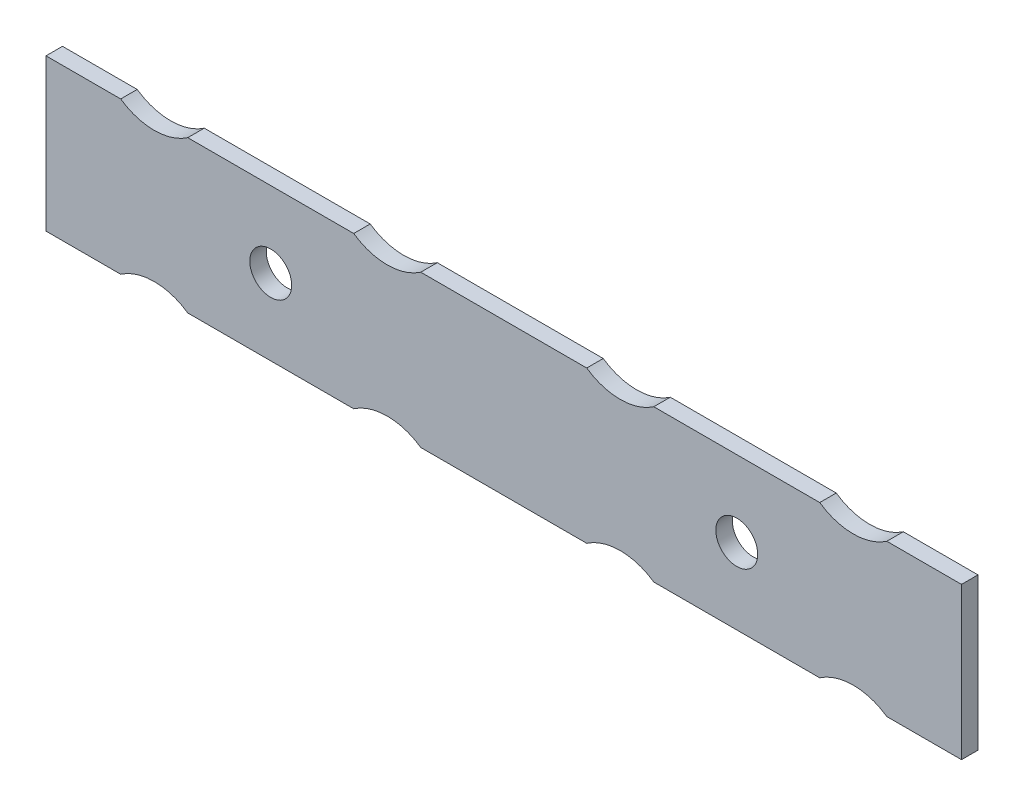
ISO-10303-21;
HEADER;
FILE_DESCRIPTION(('STEP AP214'),'2;1');
FILE_NAME('part.step','',(''),(''),'','','');
FILE_SCHEMA(('AUTOMOTIVE_DESIGN { 1 0 10303 214 1 1 1 1 }'));
ENDSEC;
DATA;
#1=APPLICATION_CONTEXT('core data for automotive mechanical design processes');
#2=APPLICATION_PROTOCOL_DEFINITION('international standard','automotive_design',2000,#1);
#3=PRODUCT_CONTEXT('',#1,'mechanical');
#4=PRODUCT('Part','Part','',(#3));
#5=PRODUCT_RELATED_PRODUCT_CATEGORY('part','',(#4));
#6=PRODUCT_DEFINITION_FORMATION('','',#4);
#7=PRODUCT_DEFINITION_CONTEXT('part definition',#1,'design');
#8=PRODUCT_DEFINITION('design','',#6,#7);
#9=PRODUCT_DEFINITION_SHAPE('','',#8);
#10=(LENGTH_UNIT() NAMED_UNIT(*) SI_UNIT(.MILLI.,.METRE.));
#11=(NAMED_UNIT(*) PLANE_ANGLE_UNIT() SI_UNIT($,.RADIAN.));
#12=(NAMED_UNIT(*) SI_UNIT($,.STERADIAN.) SOLID_ANGLE_UNIT());
#13=UNCERTAINTY_MEASURE_WITH_UNIT(LENGTH_MEASURE(1.E-05),#10,'distance_accuracy_value','');
#14=(GEOMETRIC_REPRESENTATION_CONTEXT(3) GLOBAL_UNCERTAINTY_ASSIGNED_CONTEXT((#13)) GLOBAL_UNIT_ASSIGNED_CONTEXT((#10,
#11,#12)) REPRESENTATION_CONTEXT('',''));
#15=CARTESIAN_POINT('',(0.,0.,0.));
#16=DIRECTION('',(0.,0.,1.));
#17=DIRECTION('',(1.,0.,0.));
#18=AXIS2_PLACEMENT_3D('',#15,#16,#17);
#19=CARTESIAN_POINT('',(22.606,0.,1.6));
#20=DIRECTION('',(0.,0.,1.));
#21=DIRECTION('',(1.,0.,0.));
#22=AXIS2_PLACEMENT_3D('',#19,#20,#21);
#23=PLANE('',#22);
#24=CARTESIAN_POINT('',(11.3029999999999,12.065,1.6));
#25=DIRECTION('',(0.,0.,1.));
#26=DIRECTION('',(1.,0.,0.));
#27=AXIS2_PLACEMENT_3D('',#24,#25,#26);
#28=CIRCLE('',#27,2.032);
#29=CARTESIAN_POINT('',(13.3349999999999,12.065,1.6));
#30=VERTEX_POINT('',#29);
#31=EDGE_CURVE('E209',#30,#30,#28,.T.);
#32=ORIENTED_EDGE('',*,*,#31,.F.);
#33=EDGE_LOOP('',(#32));
#34=FACE_BOUND('',#33,.T.);
#35=CARTESIAN_POINT('',(22.606,0.,1.6));
#36=DIRECTION('',(0.,0.,-1.));
#37=DIRECTION('',(1.,0.,0.));
#38=AXIS2_PLACEMENT_3D('',#35,#36,#37);
#39=CIRCLE('',#38,5.715999998);
#40=CARTESIAN_POINT('',(19.3529005554801,4.699999998,1.6));
#41=VERTEX_POINT('',#40);
#42=CARTESIAN_POINT('',(25.85909944452,4.699999998,1.6));
#43=VERTEX_POINT('',#42);
#44=EDGE_CURVE('E244',#41,#43,#39,.T.);
#45=ORIENTED_EDGE('',*,*,#44,.T.);
#46=DIRECTION('',(1.,0.,0.));
#47=VECTOR('',#46,1.);
#48=CARTESIAN_POINT('',(25.85909944452,4.699999998,1.6));
#49=LINE('',#48,#47);
#50=CARTESIAN_POINT('',(41.95890055548,4.699999998,1.6));
#51=VERTEX_POINT('',#50);
#52=EDGE_CURVE('E132',#43,#51,#49,.T.);
#53=ORIENTED_EDGE('',*,*,#52,.T.);
#54=CARTESIAN_POINT('',(45.212,0.,1.6));
#55=DIRECTION('',(0.,0.,-1.));
#56=DIRECTION('',(1.,0.,0.));
#57=AXIS2_PLACEMENT_3D('',#54,#55,#56);
#58=CIRCLE('',#57,5.715999998);
#59=CARTESIAN_POINT('',(48.46509944452,4.699999998,1.6));
#60=VERTEX_POINT('',#59);
#61=EDGE_CURVE('E295',#51,#60,#58,.T.);
#62=ORIENTED_EDGE('',*,*,#61,.T.);
#63=DIRECTION('',(1.,0.,0.));
#64=VECTOR('',#63,1.);
#65=CARTESIAN_POINT('',(48.46509944452,4.699999998,1.6));
#66=LINE('',#65,#64);
#67=CARTESIAN_POINT('',(64.5649005554801,4.699999998,1.6));
#68=VERTEX_POINT('',#67);
#69=EDGE_CURVE('E314',#60,#68,#66,.T.);
#70=ORIENTED_EDGE('',*,*,#69,.T.);
#71=CARTESIAN_POINT('',(67.818,0.,1.6));
#72=DIRECTION('',(0.,0.,-1.));
#73=DIRECTION('',(1.,0.,0.));
#74=AXIS2_PLACEMENT_3D('',#71,#72,#73);
#75=CIRCLE('',#74,5.715999998);
#76=CARTESIAN_POINT('',(71.07109944452,4.699999998,1.6));
#77=VERTEX_POINT('',#76);
#78=EDGE_CURVE('E311',#68,#77,#75,.T.);
#79=ORIENTED_EDGE('',*,*,#78,.T.);
#80=DIRECTION('',(1.,0.,0.));
#81=VECTOR('',#80,1.);
#82=CARTESIAN_POINT('',(71.07109944452,4.699999998,1.6));
#83=LINE('',#82,#81);
#84=CARTESIAN_POINT('',(78.3179999999999,4.699999998,1.6));
#85=VERTEX_POINT('',#84);
#86=EDGE_CURVE('E313',#77,#85,#83,.T.);
#87=ORIENTED_EDGE('',*,*,#86,.T.);
#88=DIRECTION('',(0.,1.,0.));
#89=VECTOR('',#88,1.);
#90=CARTESIAN_POINT('',(78.3179999999999,4.699999998,1.6));
#91=LINE('',#90,#89);
#92=CARTESIAN_POINT('',(78.3179999999999,19.430000002,1.6));
#93=VERTEX_POINT('',#92);
#94=EDGE_CURVE('E316',#85,#93,#91,.T.);
#95=ORIENTED_EDGE('',*,*,#94,.T.);
#96=DIRECTION('',(-1.,0.,0.));
#97=VECTOR('',#96,1.);
#98=CARTESIAN_POINT('',(71.0710994445199,19.430000002,1.6));
#99=LINE('',#98,#97);
#100=CARTESIAN_POINT('',(71.0710994445199,19.430000002,1.6));
#101=VERTEX_POINT('',#100);
#102=EDGE_CURVE('E322',#93,#101,#99,.T.);
#103=ORIENTED_EDGE('',*,*,#102,.T.);
#104=CARTESIAN_POINT('',(67.8179999999999,24.13,1.6));
#105=DIRECTION('',(0.,0.,-1.));
#106=DIRECTION('',(1.,0.,0.));
#107=AXIS2_PLACEMENT_3D('',#104,#105,#106);
#108=CIRCLE('',#107,5.715999998);
#109=CARTESIAN_POINT('',(64.56490055548,19.430000002,1.6));
#110=VERTEX_POINT('',#109);
#111=EDGE_CURVE('E324',#101,#110,#108,.T.);
#112=ORIENTED_EDGE('',*,*,#111,.T.);
#113=DIRECTION('',(-1.,0.,0.));
#114=VECTOR('',#113,1.);
#115=CARTESIAN_POINT('',(48.4650994445199,19.430000002,1.6));
#116=LINE('',#115,#114);
#117=CARTESIAN_POINT('',(48.4650994445199,19.430000002,1.6));
#118=VERTEX_POINT('',#117);
#119=EDGE_CURVE('E326',#110,#118,#116,.T.);
#120=ORIENTED_EDGE('',*,*,#119,.T.);
#121=CARTESIAN_POINT('',(45.2119999999999,24.13,1.6));
#122=DIRECTION('',(0.,0.,-1.));
#123=DIRECTION('',(1.,0.,0.));
#124=AXIS2_PLACEMENT_3D('',#121,#122,#123);
#125=CIRCLE('',#124,5.715999998);
#126=CARTESIAN_POINT('',(41.95890055548,19.430000002,1.6));
#127=VERTEX_POINT('',#126);
#128=EDGE_CURVE('E328',#118,#127,#125,.T.);
#129=ORIENTED_EDGE('',*,*,#128,.T.);
#130=DIRECTION('',(-1.,0.,0.));
#131=VECTOR('',#130,1.);
#132=CARTESIAN_POINT('',(25.8590994445199,19.430000002,1.6));
#133=LINE('',#132,#131);
#134=CARTESIAN_POINT('',(25.8590994445199,19.430000002,1.6));
#135=VERTEX_POINT('',#134);
#136=EDGE_CURVE('E330',#127,#135,#133,.T.);
#137=ORIENTED_EDGE('',*,*,#136,.T.);
#138=CARTESIAN_POINT('',(22.6059999999999,24.13,1.6));
#139=DIRECTION('',(0.,0.,-1.));
#140=DIRECTION('',(1.,0.,0.));
#141=AXIS2_PLACEMENT_3D('',#138,#139,#140);
#142=CIRCLE('',#141,5.715999998);
#143=CARTESIAN_POINT('',(19.35290055548,19.430000002,1.6));
#144=VERTEX_POINT('',#143);
#145=EDGE_CURVE('E332',#135,#144,#142,.T.);
#146=ORIENTED_EDGE('',*,*,#145,.T.);
#147=DIRECTION('',(-1.,0.,0.));
#148=VECTOR('',#147,1.);
#149=CARTESIAN_POINT('',(3.25309944451987,19.430000002,1.6));
#150=LINE('',#149,#148);
#151=CARTESIAN_POINT('',(3.25309944451987,19.430000002,1.6));
#152=VERTEX_POINT('',#151);
#153=EDGE_CURVE('E334',#144,#152,#150,.T.);
#154=ORIENTED_EDGE('',*,*,#153,.T.);
#155=CARTESIAN_POINT('',(0.,24.13,1.6));
#156=DIRECTION('',(0.,0.,-1.));
#157=DIRECTION('',(1.,0.,0.));
#158=AXIS2_PLACEMENT_3D('',#155,#156,#157);
#159=CIRCLE('',#158,5.715999998);
#160=CARTESIAN_POINT('',(-3.25309944452003,19.430000002,1.6));
#161=VERTEX_POINT('',#160);
#162=EDGE_CURVE('E336',#152,#161,#159,.T.);
#163=ORIENTED_EDGE('',*,*,#162,.T.);
#164=DIRECTION('',(-1.,0.,0.));
#165=VECTOR('',#164,1.);
#166=CARTESIAN_POINT('',(-10.5,19.430000002,1.6));
#167=LINE('',#166,#165);
#168=CARTESIAN_POINT('',(-10.5,19.430000002,1.6));
#169=VERTEX_POINT('',#168);
#170=EDGE_CURVE('E338',#161,#169,#167,.T.);
#171=ORIENTED_EDGE('',*,*,#170,.T.);
#172=DIRECTION('',(0.,-1.,0.));
#173=VECTOR('',#172,1.);
#174=CARTESIAN_POINT('',(-10.5,4.699999998,1.6));
#175=LINE('',#174,#173);
#176=CARTESIAN_POINT('',(-10.5,4.699999998,1.6));
#177=VERTEX_POINT('',#176);
#178=EDGE_CURVE('E187',#169,#177,#175,.T.);
#179=ORIENTED_EDGE('',*,*,#178,.T.);
#180=DIRECTION('',(1.,0.,0.));
#181=VECTOR('',#180,1.);
#182=CARTESIAN_POINT('',(-10.5,4.699999998,1.6));
#183=LINE('',#182,#181);
#184=CARTESIAN_POINT('',(-3.25309944451995,4.699999998,1.6));
#185=VERTEX_POINT('',#184);
#186=EDGE_CURVE('E181',#177,#185,#183,.T.);
#187=ORIENTED_EDGE('',*,*,#186,.T.);
#188=CARTESIAN_POINT('',(0.,0.,1.6));
#189=DIRECTION('',(0.,0.,-1.));
#190=DIRECTION('',(1.,0.,0.));
#191=AXIS2_PLACEMENT_3D('',#188,#189,#190);
#192=CIRCLE('',#191,5.715999998);
#193=CARTESIAN_POINT('',(3.25309944451995,4.699999998,1.6));
#194=VERTEX_POINT('',#193);
#195=EDGE_CURVE('E185',#185,#194,#192,.T.);
#196=ORIENTED_EDGE('',*,*,#195,.T.);
#197=DIRECTION('',(1.,0.,0.));
#198=VECTOR('',#197,1.);
#199=CARTESIAN_POINT('',(3.25309944451995,4.699999998,1.6));
#200=LINE('',#199,#198);
#201=EDGE_CURVE('E53',#194,#41,#200,.T.);
#202=ORIENTED_EDGE('',*,*,#201,.T.);
#203=EDGE_LOOP('',(#45,#53,#62,#70,#79,#87,#95,#103,#112,#120,#129,#137,#146,#154,#163,#171,
#179,#187,#196,#202));
#204=FACE_BOUND('',#203,.T.);
#205=CARTESIAN_POINT('',(56.5149999999999,12.065,1.6));
#206=DIRECTION('',(0.,0.,1.));
#207=DIRECTION('',(1.,0.,0.));
#208=AXIS2_PLACEMENT_3D('',#205,#206,#207);
#209=CIRCLE('',#208,2.032);
#210=CARTESIAN_POINT('',(58.5469999999999,12.065,1.6));
#211=VERTEX_POINT('',#210);
#212=EDGE_CURVE('E380',#211,#211,#209,.T.);
#213=ORIENTED_EDGE('',*,*,#212,.F.);
#214=EDGE_LOOP('',(#213));
#215=FACE_BOUND('',#214,.T.);
#216=ADVANCED_FACE('F36',(#34,#204,#215),#23,.T.);
#217=CARTESIAN_POINT('',(22.606,0.,0.));
#218=DIRECTION('',(0.,0.,1.));
#219=DIRECTION('',(1.,0.,0.));
#220=AXIS2_PLACEMENT_3D('',#217,#218,#219);
#221=PLANE('',#220);
#222=CARTESIAN_POINT('',(22.606,0.,0.));
#223=DIRECTION('',(0.,0.,-1.));
#224=DIRECTION('',(1.,0.,0.));
#225=AXIS2_PLACEMENT_3D('',#222,#223,#224);
#226=CIRCLE('',#225,5.715999998);
#227=CARTESIAN_POINT('',(19.3529005554801,4.699999998,0.));
#228=VERTEX_POINT('',#227);
#229=CARTESIAN_POINT('',(25.85909944452,4.699999998,0.));
#230=VERTEX_POINT('',#229);
#231=EDGE_CURVE('E205',#228,#230,#226,.T.);
#232=ORIENTED_EDGE('',*,*,#231,.F.);
#233=DIRECTION('',(1.,0.,0.));
#234=VECTOR('',#233,1.);
#235=CARTESIAN_POINT('',(3.25309944451995,4.699999998,0.));
#236=LINE('',#235,#234);
#237=CARTESIAN_POINT('',(3.25309944451995,4.699999998,0.));
#238=VERTEX_POINT('',#237);
#239=EDGE_CURVE('E124',#238,#228,#236,.T.);
#240=ORIENTED_EDGE('',*,*,#239,.F.);
#241=CARTESIAN_POINT('',(0.,0.,0.));
#242=DIRECTION('',(0.,0.,-1.));
#243=DIRECTION('',(1.,0.,0.));
#244=AXIS2_PLACEMENT_3D('',#241,#242,#243);
#245=CIRCLE('',#244,5.715999998);
#246=CARTESIAN_POINT('',(-3.25309944451995,4.699999998,0.));
#247=VERTEX_POINT('',#246);
#248=EDGE_CURVE('E118',#247,#238,#245,.T.);
#249=ORIENTED_EDGE('',*,*,#248,.F.);
#250=DIRECTION('',(1.,0.,0.));
#251=VECTOR('',#250,1.);
#252=CARTESIAN_POINT('',(-10.5,4.699999998,0.));
#253=LINE('',#252,#251);
#254=CARTESIAN_POINT('',(-10.5,4.699999998,0.));
#255=VERTEX_POINT('',#254);
#256=EDGE_CURVE('E195',#255,#247,#253,.T.);
#257=ORIENTED_EDGE('',*,*,#256,.F.);
#258=DIRECTION('',(0.,-1.,0.));
#259=VECTOR('',#258,1.);
#260=CARTESIAN_POINT('',(-10.5,4.699999998,0.));
#261=LINE('',#260,#259);
#262=CARTESIAN_POINT('',(-10.5,19.430000002,0.));
#263=VERTEX_POINT('',#262);
#264=EDGE_CURVE('E239',#263,#255,#261,.T.);
#265=ORIENTED_EDGE('',*,*,#264,.F.);
#266=DIRECTION('',(-1.,0.,0.));
#267=VECTOR('',#266,1.);
#268=CARTESIAN_POINT('',(-10.5,19.430000002,0.));
#269=LINE('',#268,#267);
#270=CARTESIAN_POINT('',(-3.25309944452003,19.430000002,0.));
#271=VERTEX_POINT('',#270);
#272=EDGE_CURVE('E237',#271,#263,#269,.T.);
#273=ORIENTED_EDGE('',*,*,#272,.F.);
#274=CARTESIAN_POINT('',(0.,24.13,0.));
#275=DIRECTION('',(0.,0.,-1.));
#276=DIRECTION('',(1.,0.,0.));
#277=AXIS2_PLACEMENT_3D('',#274,#275,#276);
#278=CIRCLE('',#277,5.715999998);
#279=CARTESIAN_POINT('',(3.25309944451987,19.430000002,0.));
#280=VERTEX_POINT('',#279);
#281=EDGE_CURVE('E235',#280,#271,#278,.T.);
#282=ORIENTED_EDGE('',*,*,#281,.F.);
#283=DIRECTION('',(-1.,0.,0.));
#284=VECTOR('',#283,1.);
#285=CARTESIAN_POINT('',(3.25309944451987,19.430000002,0.));
#286=LINE('',#285,#284);
#287=CARTESIAN_POINT('',(19.35290055548,19.430000002,0.));
#288=VERTEX_POINT('',#287);
#289=EDGE_CURVE('E233',#288,#280,#286,.T.);
#290=ORIENTED_EDGE('',*,*,#289,.F.);
#291=CARTESIAN_POINT('',(22.6059999999999,24.13,0.));
#292=DIRECTION('',(0.,0.,-1.));
#293=DIRECTION('',(1.,0.,0.));
#294=AXIS2_PLACEMENT_3D('',#291,#292,#293);
#295=CIRCLE('',#294,5.715999998);
#296=CARTESIAN_POINT('',(25.8590994445199,19.430000002,0.));
#297=VERTEX_POINT('',#296);
#298=EDGE_CURVE('E231',#297,#288,#295,.T.);
#299=ORIENTED_EDGE('',*,*,#298,.F.);
#300=DIRECTION('',(-1.,0.,0.));
#301=VECTOR('',#300,1.);
#302=CARTESIAN_POINT('',(25.8590994445199,19.430000002,0.));
#303=LINE('',#302,#301);
#304=CARTESIAN_POINT('',(41.95890055548,19.430000002,0.));
#305=VERTEX_POINT('',#304);
#306=EDGE_CURVE('E229',#305,#297,#303,.T.);
#307=ORIENTED_EDGE('',*,*,#306,.F.);
#308=CARTESIAN_POINT('',(45.2119999999999,24.13,0.));
#309=DIRECTION('',(0.,0.,-1.));
#310=DIRECTION('',(1.,0.,0.));
#311=AXIS2_PLACEMENT_3D('',#308,#309,#310);
#312=CIRCLE('',#311,5.715999998);
#313=CARTESIAN_POINT('',(48.4650994445199,19.430000002,0.));
#314=VERTEX_POINT('',#313);
#315=EDGE_CURVE('E227',#314,#305,#312,.T.);
#316=ORIENTED_EDGE('',*,*,#315,.F.);
#317=DIRECTION('',(-1.,0.,0.));
#318=VECTOR('',#317,1.);
#319=CARTESIAN_POINT('',(48.4650994445199,19.430000002,0.));
#320=LINE('',#319,#318);
#321=CARTESIAN_POINT('',(64.56490055548,19.430000002,0.));
#322=VERTEX_POINT('',#321);
#323=EDGE_CURVE('E225',#322,#314,#320,.T.);
#324=ORIENTED_EDGE('',*,*,#323,.F.);
#325=CARTESIAN_POINT('',(67.8179999999999,24.13,0.));
#326=DIRECTION('',(0.,0.,-1.));
#327=DIRECTION('',(1.,0.,0.));
#328=AXIS2_PLACEMENT_3D('',#325,#326,#327);
#329=CIRCLE('',#328,5.715999998);
#330=CARTESIAN_POINT('',(71.0710994445199,19.430000002,0.));
#331=VERTEX_POINT('',#330);
#332=EDGE_CURVE('E223',#331,#322,#329,.T.);
#333=ORIENTED_EDGE('',*,*,#332,.F.);
#334=DIRECTION('',(-1.,0.,0.));
#335=VECTOR('',#334,1.);
#336=CARTESIAN_POINT('',(71.0710994445199,19.430000002,0.));
#337=LINE('',#336,#335);
#338=CARTESIAN_POINT('',(78.3179999999999,19.430000002,0.));
#339=VERTEX_POINT('',#338);
#340=EDGE_CURVE('E221',#339,#331,#337,.T.);
#341=ORIENTED_EDGE('',*,*,#340,.F.);
#342=DIRECTION('',(0.,1.,0.));
#343=VECTOR('',#342,1.);
#344=CARTESIAN_POINT('',(78.3179999999999,4.699999998,0.));
#345=LINE('',#344,#343);
#346=CARTESIAN_POINT('',(78.3179999999999,4.699999998,0.));
#347=VERTEX_POINT('',#346);
#348=EDGE_CURVE('E219',#347,#339,#345,.T.);
#349=ORIENTED_EDGE('',*,*,#348,.F.);
#350=DIRECTION('',(1.,0.,0.));
#351=VECTOR('',#350,1.);
#352=CARTESIAN_POINT('',(71.07109944452,4.699999998,0.));
#353=LINE('',#352,#351);
#354=CARTESIAN_POINT('',(71.07109944452,4.699999998,0.));
#355=VERTEX_POINT('',#354);
#356=EDGE_CURVE('E217',#355,#347,#353,.T.);
#357=ORIENTED_EDGE('',*,*,#356,.F.);
#358=CARTESIAN_POINT('',(67.818,0.,0.));
#359=DIRECTION('',(0.,0.,-1.));
#360=DIRECTION('',(1.,0.,0.));
#361=AXIS2_PLACEMENT_3D('',#358,#359,#360);
#362=CIRCLE('',#361,5.715999998);
#363=CARTESIAN_POINT('',(64.5649005554801,4.699999998,0.));
#364=VERTEX_POINT('',#363);
#365=EDGE_CURVE('E215',#364,#355,#362,.T.);
#366=ORIENTED_EDGE('',*,*,#365,.F.);
#367=DIRECTION('',(1.,0.,0.));
#368=VECTOR('',#367,1.);
#369=CARTESIAN_POINT('',(48.46509944452,4.699999998,0.));
#370=LINE('',#369,#368);
#371=CARTESIAN_POINT('',(48.46509944452,4.699999998,0.));
#372=VERTEX_POINT('',#371);
#373=EDGE_CURVE('E213',#372,#364,#370,.T.);
#374=ORIENTED_EDGE('',*,*,#373,.F.);
#375=CARTESIAN_POINT('',(45.212,0.,0.));
#376=DIRECTION('',(0.,0.,-1.));
#377=DIRECTION('',(1.,0.,0.));
#378=AXIS2_PLACEMENT_3D('',#375,#376,#377);
#379=CIRCLE('',#378,5.715999998);
#380=CARTESIAN_POINT('',(41.95890055548,4.699999998,0.));
#381=VERTEX_POINT('',#380);
#382=EDGE_CURVE('E211',#381,#372,#379,.T.);
#383=ORIENTED_EDGE('',*,*,#382,.F.);
#384=DIRECTION('',(1.,0.,0.));
#385=VECTOR('',#384,1.);
#386=CARTESIAN_POINT('',(25.85909944452,4.699999998,0.));
#387=LINE('',#386,#385);
#388=EDGE_CURVE('E208',#230,#381,#387,.T.);
#389=ORIENTED_EDGE('',*,*,#388,.F.);
#390=EDGE_LOOP('',(#232,#240,#249,#257,#265,#273,#282,#290,#299,#307,#316,#324,#333,#341,#349,
#357,#366,#374,#383,#389));
#391=FACE_BOUND('',#390,.T.);
#392=CARTESIAN_POINT('',(11.3029999999999,12.065,0.));
#393=DIRECTION('',(0.,0.,1.));
#394=DIRECTION('',(1.,0.,0.));
#395=AXIS2_PLACEMENT_3D('',#392,#393,#394);
#396=CIRCLE('',#395,2.032);
#397=CARTESIAN_POINT('',(13.3349999999999,12.065,0.));
#398=VERTEX_POINT('',#397);
#399=EDGE_CURVE('E386',#398,#398,#396,.T.);
#400=ORIENTED_EDGE('',*,*,#399,.T.);
#401=EDGE_LOOP('',(#400));
#402=FACE_BOUND('',#401,.T.);
#403=CARTESIAN_POINT('',(56.5149999999999,12.065,0.));
#404=DIRECTION('',(0.,0.,1.));
#405=DIRECTION('',(1.,0.,0.));
#406=AXIS2_PLACEMENT_3D('',#403,#404,#405);
#407=CIRCLE('',#406,2.032);
#408=CARTESIAN_POINT('',(58.5469999999999,12.065,0.));
#409=VERTEX_POINT('',#408);
#410=EDGE_CURVE('E383',#409,#409,#407,.T.);
#411=ORIENTED_EDGE('',*,*,#410,.T.);
#412=EDGE_LOOP('',(#411));
#413=FACE_BOUND('',#412,.T.);
#414=ADVANCED_FACE('F299',(#391,#402,#413),#221,.F.);
#415=CARTESIAN_POINT('',(22.606,0.,1.6));
#416=DIRECTION('',(0.,0.,-1.));
#417=DIRECTION('',(-1.,0.,0.));
#418=AXIS2_PLACEMENT_3D('',#415,#416,#417);
#419=CYLINDRICAL_SURFACE('',#418,5.715999998);
#420=ORIENTED_EDGE('',*,*,#231,.T.);
#421=DIRECTION('',(0.,0.,-1.));
#422=VECTOR('',#421,1.);
#423=CARTESIAN_POINT('',(25.85909944452,4.699999998,1.6));
#424=LINE('',#423,#422);
#425=EDGE_CURVE('E11',#43,#230,#424,.T.);
#426=ORIENTED_EDGE('',*,*,#425,.F.);
#427=ORIENTED_EDGE('',*,*,#44,.F.);
#428=DIRECTION('',(0.,0.,-1.));
#429=VECTOR('',#428,1.);
#430=CARTESIAN_POINT('',(19.3529005554801,4.699999998,1.6));
#431=LINE('',#430,#429);
#432=EDGE_CURVE('E201',#41,#228,#431,.T.);
#433=ORIENTED_EDGE('',*,*,#432,.T.);
#434=EDGE_LOOP('',(#420,#426,#427,#433));
#435=FACE_BOUND('',#434,.T.);
#436=ADVANCED_FACE('F38',(#435),#419,.F.);
#437=CARTESIAN_POINT('',(25.85909944452,4.699999998,1.6));
#438=DIRECTION('',(0.,1.,0.));
#439=DIRECTION('',(0.,0.,1.));
#440=AXIS2_PLACEMENT_3D('',#437,#438,#439);
#441=PLANE('',#440);
#442=ORIENTED_EDGE('',*,*,#388,.T.);
#443=DIRECTION('',(0.,0.,-1.));
#444=VECTOR('',#443,1.);
#445=CARTESIAN_POINT('',(41.95890055548,4.699999998,1.6));
#446=LINE('',#445,#444);
#447=EDGE_CURVE('E45',#51,#381,#446,.T.);
#448=ORIENTED_EDGE('',*,*,#447,.F.);
#449=ORIENTED_EDGE('',*,*,#52,.F.);
#450=ORIENTED_EDGE('',*,*,#425,.T.);
#451=EDGE_LOOP('',(#442,#448,#449,#450));
#452=FACE_BOUND('',#451,.T.);
#453=ADVANCED_FACE('F559',(#452),#441,.F.);
#454=CARTESIAN_POINT('',(45.212,0.,1.6));
#455=DIRECTION('',(0.,0.,-1.));
#456=DIRECTION('',(-1.,0.,0.));
#457=AXIS2_PLACEMENT_3D('',#454,#455,#456);
#458=CYLINDRICAL_SURFACE('',#457,5.715999998);
#459=ORIENTED_EDGE('',*,*,#382,.T.);
#460=DIRECTION('',(0.,0.,-1.));
#461=VECTOR('',#460,1.);
#462=CARTESIAN_POINT('',(48.46509944452,4.699999998,1.6));
#463=LINE('',#462,#461);
#464=EDGE_CURVE('E287',#60,#372,#463,.T.);
#465=ORIENTED_EDGE('',*,*,#464,.F.);
#466=ORIENTED_EDGE('',*,*,#61,.F.);
#467=ORIENTED_EDGE('',*,*,#447,.T.);
#468=EDGE_LOOP('',(#459,#465,#466,#467));
#469=FACE_BOUND('',#468,.T.);
#470=ADVANCED_FACE('F293',(#469),#458,.F.);
#471=CARTESIAN_POINT('',(48.46509944452,4.699999998,1.6));
#472=DIRECTION('',(0.,1.,0.));
#473=DIRECTION('',(-1.,0.,0.));
#474=AXIS2_PLACEMENT_3D('',#471,#472,#473);
#475=PLANE('',#474);
#476=ORIENTED_EDGE('',*,*,#373,.T.);
#477=DIRECTION('',(0.,0.,-1.));
#478=VECTOR('',#477,1.);
#479=CARTESIAN_POINT('',(64.5649005554801,4.699999998,1.6));
#480=LINE('',#479,#478);
#481=EDGE_CURVE('E284',#68,#364,#480,.T.);
#482=ORIENTED_EDGE('',*,*,#481,.F.);
#483=ORIENTED_EDGE('',*,*,#69,.F.);
#484=ORIENTED_EDGE('',*,*,#464,.T.);
#485=EDGE_LOOP('',(#476,#482,#483,#484));
#486=FACE_BOUND('',#485,.T.);
#487=ADVANCED_FACE('F305',(#486),#475,.F.);
#488=CARTESIAN_POINT('',(67.818,0.,1.6));
#489=DIRECTION('',(0.,0.,-1.));
#490=DIRECTION('',(-1.,0.,0.));
#491=AXIS2_PLACEMENT_3D('',#488,#489,#490);
#492=CYLINDRICAL_SURFACE('',#491,5.715999998);
#493=ORIENTED_EDGE('',*,*,#365,.T.);
#494=DIRECTION('',(0.,0.,-1.));
#495=VECTOR('',#494,1.);
#496=CARTESIAN_POINT('',(71.07109944452,4.699999998,1.6));
#497=LINE('',#496,#495);
#498=EDGE_CURVE('E281',#77,#355,#497,.T.);
#499=ORIENTED_EDGE('',*,*,#498,.F.);
#500=ORIENTED_EDGE('',*,*,#78,.F.);
#501=ORIENTED_EDGE('',*,*,#481,.T.);
#502=EDGE_LOOP('',(#493,#499,#500,#501));
#503=FACE_BOUND('',#502,.T.);
#504=ADVANCED_FACE('F309',(#503),#492,.F.);
#505=CARTESIAN_POINT('',(71.07109944452,4.699999998,1.6));
#506=DIRECTION('',(0.,1.,0.));
#507=DIRECTION('',(-1.,0.,0.));
#508=AXIS2_PLACEMENT_3D('',#505,#506,#507);
#509=PLANE('',#508);
#510=ORIENTED_EDGE('',*,*,#356,.T.);
#511=DIRECTION('',(0.,0.,-1.));
#512=VECTOR('',#511,1.);
#513=CARTESIAN_POINT('',(78.3179999999999,4.699999998,1.6));
#514=LINE('',#513,#512);
#515=EDGE_CURVE('E278',#85,#347,#514,.T.);
#516=ORIENTED_EDGE('',*,*,#515,.F.);
#517=ORIENTED_EDGE('',*,*,#86,.F.);
#518=ORIENTED_EDGE('',*,*,#498,.T.);
#519=EDGE_LOOP('',(#510,#516,#517,#518));
#520=FACE_BOUND('',#519,.T.);
#521=ADVANCED_FACE('F524',(#520),#509,.F.);
#522=CARTESIAN_POINT('',(78.3179999999999,4.699999998,1.6));
#523=DIRECTION('',(-1.,0.,0.));
#524=DIRECTION('',(0.,0.,1.));
#525=AXIS2_PLACEMENT_3D('',#522,#523,#524);
#526=PLANE('',#525);
#527=ORIENTED_EDGE('',*,*,#348,.T.);
#528=DIRECTION('',(0.,0.,-1.));
#529=VECTOR('',#528,1.);
#530=CARTESIAN_POINT('',(78.3179999999999,19.430000002,1.6));
#531=LINE('',#530,#529);
#532=EDGE_CURVE('E275',#93,#339,#531,.T.);
#533=ORIENTED_EDGE('',*,*,#532,.F.);
#534=ORIENTED_EDGE('',*,*,#94,.F.);
#535=ORIENTED_EDGE('',*,*,#515,.T.);
#536=EDGE_LOOP('',(#527,#533,#534,#535));
#537=FACE_BOUND('',#536,.T.);
#538=ADVANCED_FACE('F514',(#537),#526,.F.);
#539=CARTESIAN_POINT('',(71.0710994445199,19.430000002,1.6));
#540=DIRECTION('',(0.,-1.,0.));
#541=DIRECTION('',(0.,0.,-1.));
#542=AXIS2_PLACEMENT_3D('',#539,#540,#541);
#543=PLANE('',#542);
#544=ORIENTED_EDGE('',*,*,#340,.T.);
#545=DIRECTION('',(0.,0.,-1.));
#546=VECTOR('',#545,1.);
#547=CARTESIAN_POINT('',(71.0710994445199,19.430000002,1.6));
#548=LINE('',#547,#546);
#549=EDGE_CURVE('E272',#101,#331,#548,.T.);
#550=ORIENTED_EDGE('',*,*,#549,.F.);
#551=ORIENTED_EDGE('',*,*,#102,.F.);
#552=ORIENTED_EDGE('',*,*,#532,.T.);
#553=EDGE_LOOP('',(#544,#550,#551,#552));
#554=FACE_BOUND('',#553,.T.);
#555=ADVANCED_FACE('F504',(#554),#543,.F.);
#556=CARTESIAN_POINT('',(67.8179999999999,24.13,1.6));
#557=DIRECTION('',(0.,0.,-1.));
#558=DIRECTION('',(-1.,0.,0.));
#559=AXIS2_PLACEMENT_3D('',#556,#557,#558);
#560=CYLINDRICAL_SURFACE('',#559,5.715999998);
#561=ORIENTED_EDGE('',*,*,#332,.T.);
#562=DIRECTION('',(0.,0.,-1.));
#563=VECTOR('',#562,1.);
#564=CARTESIAN_POINT('',(64.56490055548,19.430000002,1.6));
#565=LINE('',#564,#563);
#566=EDGE_CURVE('E269',#110,#322,#565,.T.);
#567=ORIENTED_EDGE('',*,*,#566,.F.);
#568=ORIENTED_EDGE('',*,*,#111,.F.);
#569=ORIENTED_EDGE('',*,*,#549,.T.);
#570=EDGE_LOOP('',(#561,#567,#568,#569));
#571=FACE_BOUND('',#570,.T.);
#572=ADVANCED_FACE('F494',(#571),#560,.F.);
#573=CARTESIAN_POINT('',(48.4650994445199,19.430000002,1.6));
#574=DIRECTION('',(0.,-1.,0.));
#575=DIRECTION('',(0.,0.,-1.));
#576=AXIS2_PLACEMENT_3D('',#573,#574,#575);
#577=PLANE('',#576);
#578=ORIENTED_EDGE('',*,*,#323,.T.);
#579=DIRECTION('',(0.,0.,-1.));
#580=VECTOR('',#579,1.);
#581=CARTESIAN_POINT('',(48.4650994445199,19.430000002,1.6));
#582=LINE('',#581,#580);
#583=EDGE_CURVE('E266',#118,#314,#582,.T.);
#584=ORIENTED_EDGE('',*,*,#583,.F.);
#585=ORIENTED_EDGE('',*,*,#119,.F.);
#586=ORIENTED_EDGE('',*,*,#566,.T.);
#587=EDGE_LOOP('',(#578,#584,#585,#586));
#588=FACE_BOUND('',#587,.T.);
#589=ADVANCED_FACE('F484',(#588),#577,.F.);
#590=CARTESIAN_POINT('',(45.2119999999999,24.13,1.6));
#591=DIRECTION('',(0.,0.,-1.));
#592=DIRECTION('',(-1.,0.,0.));
#593=AXIS2_PLACEMENT_3D('',#590,#591,#592);
#594=CYLINDRICAL_SURFACE('',#593,5.715999998);
#595=ORIENTED_EDGE('',*,*,#315,.T.);
#596=DIRECTION('',(0.,0.,-1.));
#597=VECTOR('',#596,1.);
#598=CARTESIAN_POINT('',(41.95890055548,19.430000002,1.6));
#599=LINE('',#598,#597);
#600=EDGE_CURVE('E263',#127,#305,#599,.T.);
#601=ORIENTED_EDGE('',*,*,#600,.F.);
#602=ORIENTED_EDGE('',*,*,#128,.F.);
#603=ORIENTED_EDGE('',*,*,#583,.T.);
#604=EDGE_LOOP('',(#595,#601,#602,#603));
#605=FACE_BOUND('',#604,.T.);
#606=ADVANCED_FACE('F474',(#605),#594,.F.);
#607=CARTESIAN_POINT('',(25.8590994445199,19.430000002,1.6));
#608=DIRECTION('',(0.,-1.,0.));
#609=DIRECTION('',(0.,0.,-1.));
#610=AXIS2_PLACEMENT_3D('',#607,#608,#609);
#611=PLANE('',#610);
#612=ORIENTED_EDGE('',*,*,#306,.T.);
#613=DIRECTION('',(0.,0.,-1.));
#614=VECTOR('',#613,1.);
#615=CARTESIAN_POINT('',(25.8590994445199,19.430000002,1.6));
#616=LINE('',#615,#614);
#617=EDGE_CURVE('E260',#135,#297,#616,.T.);
#618=ORIENTED_EDGE('',*,*,#617,.F.);
#619=ORIENTED_EDGE('',*,*,#136,.F.);
#620=ORIENTED_EDGE('',*,*,#600,.T.);
#621=EDGE_LOOP('',(#612,#618,#619,#620));
#622=FACE_BOUND('',#621,.T.);
#623=ADVANCED_FACE('F464',(#622),#611,.F.);
#624=CARTESIAN_POINT('',(22.6059999999999,24.13,1.6));
#625=DIRECTION('',(0.,0.,-1.));
#626=DIRECTION('',(-1.,0.,0.));
#627=AXIS2_PLACEMENT_3D('',#624,#625,#626);
#628=CYLINDRICAL_SURFACE('',#627,5.715999998);
#629=ORIENTED_EDGE('',*,*,#298,.T.);
#630=DIRECTION('',(0.,0.,-1.));
#631=VECTOR('',#630,1.);
#632=CARTESIAN_POINT('',(19.35290055548,19.430000002,1.6));
#633=LINE('',#632,#631);
#634=EDGE_CURVE('E257',#144,#288,#633,.T.);
#635=ORIENTED_EDGE('',*,*,#634,.F.);
#636=ORIENTED_EDGE('',*,*,#145,.F.);
#637=ORIENTED_EDGE('',*,*,#617,.T.);
#638=EDGE_LOOP('',(#629,#635,#636,#637));
#639=FACE_BOUND('',#638,.T.);
#640=ADVANCED_FACE('F454',(#639),#628,.F.);
#641=CARTESIAN_POINT('',(3.25309944451987,19.430000002,1.6));
#642=DIRECTION('',(0.,-1.,0.));
#643=DIRECTION('',(0.,0.,-1.));
#644=AXIS2_PLACEMENT_3D('',#641,#642,#643);
#645=PLANE('',#644);
#646=ORIENTED_EDGE('',*,*,#289,.T.);
#647=DIRECTION('',(0.,0.,-1.));
#648=VECTOR('',#647,1.);
#649=CARTESIAN_POINT('',(3.25309944451987,19.430000002,1.6));
#650=LINE('',#649,#648);
#651=EDGE_CURVE('E254',#152,#280,#650,.T.);
#652=ORIENTED_EDGE('',*,*,#651,.F.);
#653=ORIENTED_EDGE('',*,*,#153,.F.);
#654=ORIENTED_EDGE('',*,*,#634,.T.);
#655=EDGE_LOOP('',(#646,#652,#653,#654));
#656=FACE_BOUND('',#655,.T.);
#657=ADVANCED_FACE('F444',(#656),#645,.F.);
#658=CARTESIAN_POINT('',(0.,24.13,1.6));
#659=DIRECTION('',(0.,0.,-1.));
#660=DIRECTION('',(-1.,0.,0.));
#661=AXIS2_PLACEMENT_3D('',#658,#659,#660);
#662=CYLINDRICAL_SURFACE('',#661,5.715999998);
#663=ORIENTED_EDGE('',*,*,#281,.T.);
#664=DIRECTION('',(0.,0.,-1.));
#665=VECTOR('',#664,1.);
#666=CARTESIAN_POINT('',(-3.25309944452003,19.430000002,1.6));
#667=LINE('',#666,#665);
#668=EDGE_CURVE('E251',#161,#271,#667,.T.);
#669=ORIENTED_EDGE('',*,*,#668,.F.);
#670=ORIENTED_EDGE('',*,*,#162,.F.);
#671=ORIENTED_EDGE('',*,*,#651,.T.);
#672=EDGE_LOOP('',(#663,#669,#670,#671));
#673=FACE_BOUND('',#672,.T.);
#674=ADVANCED_FACE('F435',(#673),#662,.F.);
#675=CARTESIAN_POINT('',(-10.5,19.430000002,1.6));
#676=DIRECTION('',(0.,-1.,0.));
#677=DIRECTION('',(0.,0.,-1.));
#678=AXIS2_PLACEMENT_3D('',#675,#676,#677);
#679=PLANE('',#678);
#680=ORIENTED_EDGE('',*,*,#272,.T.);
#681=DIRECTION('',(0.,0.,-1.));
#682=VECTOR('',#681,1.);
#683=CARTESIAN_POINT('',(-10.5,19.430000002,1.6));
#684=LINE('',#683,#682);
#685=EDGE_CURVE('E248',#169,#263,#684,.T.);
#686=ORIENTED_EDGE('',*,*,#685,.F.);
#687=ORIENTED_EDGE('',*,*,#170,.F.);
#688=ORIENTED_EDGE('',*,*,#668,.T.);
#689=EDGE_LOOP('',(#680,#686,#687,#688));
#690=FACE_BOUND('',#689,.T.);
#691=ADVANCED_FACE('F344',(#690),#679,.F.);
#692=CARTESIAN_POINT('',(-10.5,4.699999998,1.6));
#693=DIRECTION('',(1.,0.,0.));
#694=DIRECTION('',(0.,0.,-1.));
#695=AXIS2_PLACEMENT_3D('',#692,#693,#694);
#696=PLANE('',#695);
#697=ORIENTED_EDGE('',*,*,#264,.T.);
#698=DIRECTION('',(0.,0.,-1.));
#699=VECTOR('',#698,1.);
#700=CARTESIAN_POINT('',(-10.5,4.699999998,1.6));
#701=LINE('',#700,#699);
#702=EDGE_CURVE('E196',#177,#255,#701,.T.);
#703=ORIENTED_EDGE('',*,*,#702,.F.);
#704=ORIENTED_EDGE('',*,*,#178,.F.);
#705=ORIENTED_EDGE('',*,*,#685,.T.);
#706=EDGE_LOOP('',(#697,#703,#704,#705));
#707=FACE_BOUND('',#706,.T.);
#708=ADVANCED_FACE('F348',(#707),#696,.F.);
#709=CARTESIAN_POINT('',(-10.5,4.699999998,1.6));
#710=DIRECTION('',(0.,1.,0.));
#711=DIRECTION('',(0.,0.,1.));
#712=AXIS2_PLACEMENT_3D('',#709,#710,#711);
#713=PLANE('',#712);
#714=ORIENTED_EDGE('',*,*,#256,.T.);
#715=DIRECTION('',(0.,0.,-1.));
#716=VECTOR('',#715,1.);
#717=CARTESIAN_POINT('',(-3.25309944451995,4.699999998,1.6));
#718=LINE('',#717,#716);
#719=EDGE_CURVE('E192',#185,#247,#718,.T.);
#720=ORIENTED_EDGE('',*,*,#719,.F.);
#721=ORIENTED_EDGE('',*,*,#186,.F.);
#722=ORIENTED_EDGE('',*,*,#702,.T.);
#723=EDGE_LOOP('',(#714,#720,#721,#722));
#724=FACE_BOUND('',#723,.T.);
#725=ADVANCED_FACE('F193',(#724),#713,.F.);
#726=CARTESIAN_POINT('',(0.,0.,1.6));
#727=DIRECTION('',(0.,0.,-1.));
#728=DIRECTION('',(-1.,0.,0.));
#729=AXIS2_PLACEMENT_3D('',#726,#727,#728);
#730=CYLINDRICAL_SURFACE('',#729,5.715999998);
#731=ORIENTED_EDGE('',*,*,#248,.T.);
#732=DIRECTION('',(0.,0.,-1.));
#733=VECTOR('',#732,1.);
#734=CARTESIAN_POINT('',(3.25309944451995,4.699999998,1.6));
#735=LINE('',#734,#733);
#736=EDGE_CURVE('E197',#194,#238,#735,.T.);
#737=ORIENTED_EDGE('',*,*,#736,.F.);
#738=ORIENTED_EDGE('',*,*,#195,.F.);
#739=ORIENTED_EDGE('',*,*,#719,.T.);
#740=EDGE_LOOP('',(#731,#737,#738,#739));
#741=FACE_BOUND('',#740,.T.);
#742=ADVANCED_FACE('F199',(#741),#730,.F.);
#743=CARTESIAN_POINT('',(3.25309944451995,4.699999998,1.6));
#744=DIRECTION('',(0.,1.,0.));
#745=DIRECTION('',(0.,0.,1.));
#746=AXIS2_PLACEMENT_3D('',#743,#744,#745);
#747=PLANE('',#746);
#748=ORIENTED_EDGE('',*,*,#239,.T.);
#749=ORIENTED_EDGE('',*,*,#432,.F.);
#750=ORIENTED_EDGE('',*,*,#201,.F.);
#751=ORIENTED_EDGE('',*,*,#736,.T.);
#752=EDGE_LOOP('',(#748,#749,#750,#751));
#753=FACE_BOUND('',#752,.T.);
#754=ADVANCED_FACE('F352',(#753),#747,.F.);
#755=CARTESIAN_POINT('',(11.3029999999999,12.065,1.6));
#756=DIRECTION('',(0.,0.,-1.));
#757=DIRECTION('',(-1.,0.,0.));
#758=AXIS2_PLACEMENT_3D('',#755,#756,#757);
#759=CYLINDRICAL_SURFACE('',#758,2.032);
#760=ORIENTED_EDGE('',*,*,#31,.T.);
#761=EDGE_LOOP('',(#760));
#762=FACE_BOUND('',#761,.T.);
#763=ORIENTED_EDGE('',*,*,#399,.F.);
#764=EDGE_LOOP('',(#763));
#765=FACE_BOUND('',#764,.T.);
#766=ADVANCED_FACE('F354',(#762,#765),#759,.F.);
#767=CARTESIAN_POINT('',(56.5149999999999,12.065,1.6));
#768=DIRECTION('',(0.,0.,-1.));
#769=DIRECTION('',(-1.,0.,0.));
#770=AXIS2_PLACEMENT_3D('',#767,#768,#769);
#771=CYLINDRICAL_SURFACE('',#770,2.032);
#772=ORIENTED_EDGE('',*,*,#212,.T.);
#773=EDGE_LOOP('',(#772));
#774=FACE_BOUND('',#773,.T.);
#775=ORIENTED_EDGE('',*,*,#410,.F.);
#776=EDGE_LOOP('',(#775));
#777=FACE_BOUND('',#776,.T.);
#778=ADVANCED_FACE('F360',(#774,#777),#771,.F.);
#779=CLOSED_SHELL('',(#216,#414,#436,#453,#470,#487,#504,#521,#538,#555,#572,#589,#606,#623,
#640,#657,#674,#691,#708,#725,#742,#754,#766,#778));
#780=MANIFOLD_SOLID_BREP('B2',#779);
#781=ADVANCED_BREP_SHAPE_REPRESENTATION('',(#18,#780),#14);
#782=SHAPE_DEFINITION_REPRESENTATION(#9,#781);
ENDSEC;
END-ISO-10303-21;
